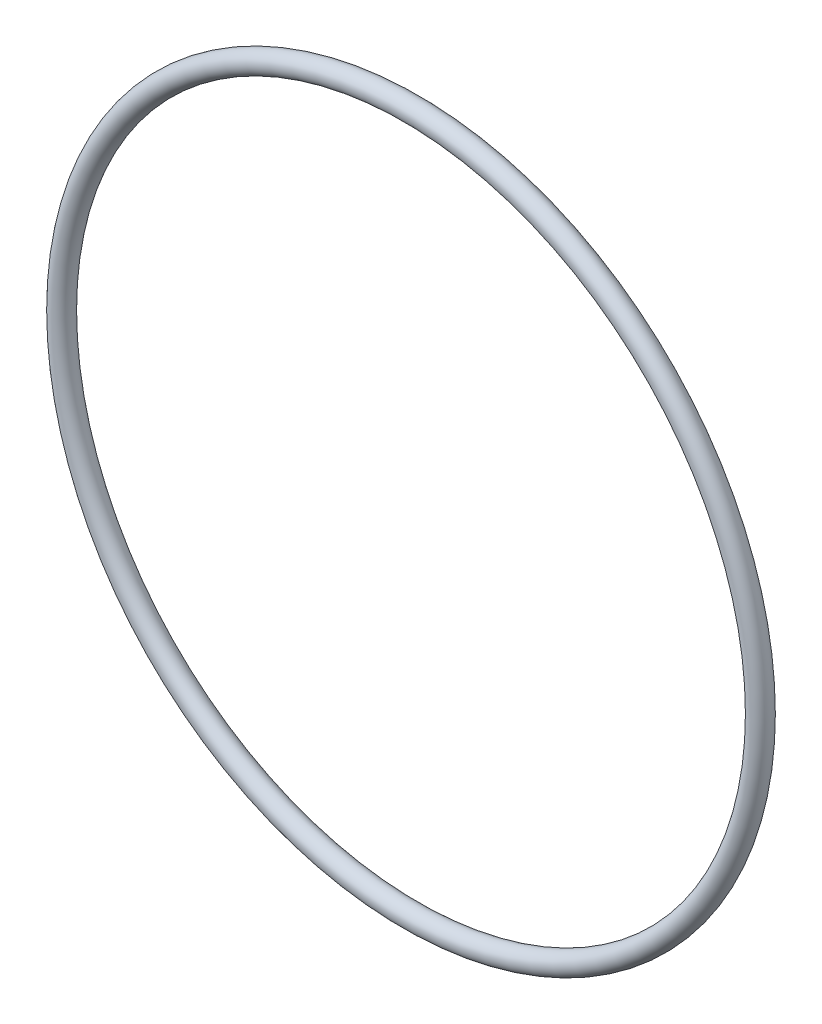
ISO-10303-21;
HEADER;
FILE_DESCRIPTION(('STEP AP214'),'2;1');
FILE_NAME('part.step','',(''),(''),'','','');
FILE_SCHEMA(('AUTOMOTIVE_DESIGN { 1 0 10303 214 1 1 1 1 }'));
ENDSEC;
DATA;
#1=APPLICATION_CONTEXT('core data for automotive mechanical design processes');
#2=APPLICATION_PROTOCOL_DEFINITION('international standard','automotive_design',2000,#1);
#3=PRODUCT_CONTEXT('',#1,'mechanical');
#4=PRODUCT('Part','Part','',(#3));
#5=PRODUCT_RELATED_PRODUCT_CATEGORY('part','',(#4));
#6=PRODUCT_DEFINITION_FORMATION('','',#4);
#7=PRODUCT_DEFINITION_CONTEXT('part definition',#1,'design');
#8=PRODUCT_DEFINITION('design','',#6,#7);
#9=PRODUCT_DEFINITION_SHAPE('','',#8);
#10=(LENGTH_UNIT() NAMED_UNIT(*) SI_UNIT(.MILLI.,.METRE.));
#11=(NAMED_UNIT(*) PLANE_ANGLE_UNIT() SI_UNIT($,.RADIAN.));
#12=(NAMED_UNIT(*) SI_UNIT($,.STERADIAN.) SOLID_ANGLE_UNIT());
#13=UNCERTAINTY_MEASURE_WITH_UNIT(LENGTH_MEASURE(1.E-05),#10,'distance_accuracy_value','');
#14=(GEOMETRIC_REPRESENTATION_CONTEXT(3) GLOBAL_UNCERTAINTY_ASSIGNED_CONTEXT((#13)) GLOBAL_UNIT_ASSIGNED_CONTEXT((#10,
#11,#12)) REPRESENTATION_CONTEXT('',''));
#15=CARTESIAN_POINT('',(0.,0.,0.));
#16=DIRECTION('',(0.,0.,1.));
#17=DIRECTION('',(1.,0.,0.));
#18=AXIS2_PLACEMENT_3D('',#15,#16,#17);
#19=CARTESIAN_POINT('',(0.,0.,0.));
#20=DIRECTION('',(0.,0.,1.));
#21=DIRECTION('',(1.,0.,0.));
#22=AXIS2_PLACEMENT_3D('',#19,#20,#21);
#23=TOROIDAL_SURFACE('',#22,29.3243,0.888999999999996);
#24=CARTESIAN_POINT('',(30.2133,0.,0.));
#25=VERTEX_POINT('',#24);
#26=VERTEX_LOOP('',#25);
#27=FACE_BOUND('',#26,.T.);
#28=ADVANCED_FACE('F35',(#27),#23,.T.);
#29=CLOSED_SHELL('',(#28));
#30=MANIFOLD_SOLID_BREP('B2',#29);
#31=ADVANCED_BREP_SHAPE_REPRESENTATION('',(#18,#30),#14);
#32=SHAPE_DEFINITION_REPRESENTATION(#9,#31);
ENDSEC;
END-ISO-10303-21;
